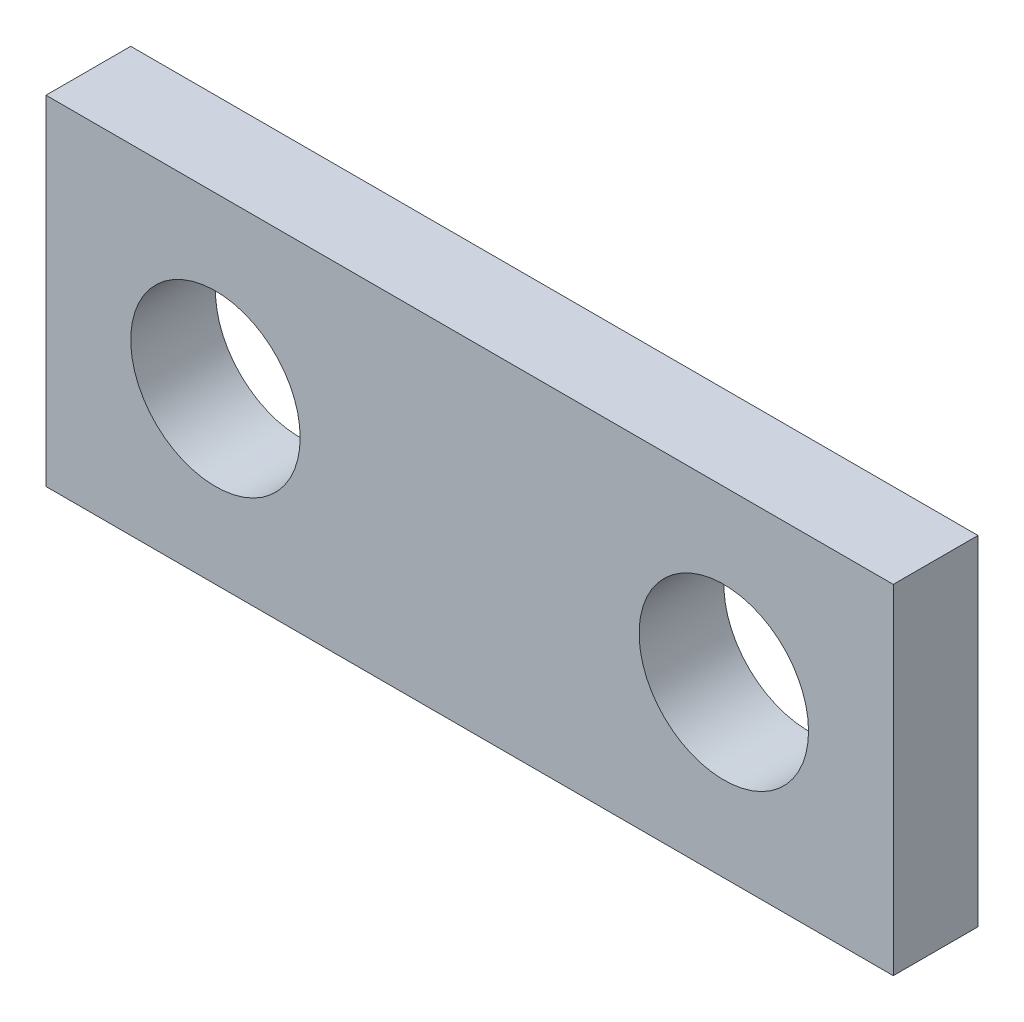
ISO-10303-21;
HEADER;
FILE_DESCRIPTION(('STEP AP214'),'2;1');
FILE_NAME('part.step','',(''),(''),'','','');
FILE_SCHEMA(('AUTOMOTIVE_DESIGN { 1 0 10303 214 1 1 1 1 }'));
ENDSEC;
DATA;
#1=APPLICATION_CONTEXT('core data for automotive mechanical design processes');
#2=APPLICATION_PROTOCOL_DEFINITION('international standard','automotive_design',2000,#1);
#3=PRODUCT_CONTEXT('',#1,'mechanical');
#4=PRODUCT('Part','Part','',(#3));
#5=PRODUCT_RELATED_PRODUCT_CATEGORY('part','',(#4));
#6=PRODUCT_DEFINITION_FORMATION('','',#4);
#7=PRODUCT_DEFINITION_CONTEXT('part definition',#1,'design');
#8=PRODUCT_DEFINITION('design','',#6,#7);
#9=PRODUCT_DEFINITION_SHAPE('','',#8);
#10=(LENGTH_UNIT() NAMED_UNIT(*) SI_UNIT(.MILLI.,.METRE.));
#11=(NAMED_UNIT(*) PLANE_ANGLE_UNIT() SI_UNIT($,.RADIAN.));
#12=(NAMED_UNIT(*) SI_UNIT($,.STERADIAN.) SOLID_ANGLE_UNIT());
#13=UNCERTAINTY_MEASURE_WITH_UNIT(LENGTH_MEASURE(1.E-05),#10,'distance_accuracy_value','');
#14=(GEOMETRIC_REPRESENTATION_CONTEXT(3) GLOBAL_UNCERTAINTY_ASSIGNED_CONTEXT((#13)) GLOBAL_UNIT_ASSIGNED_CONTEXT((#10,
#11,#12)) REPRESENTATION_CONTEXT('',''));
#15=CARTESIAN_POINT('',(0.,0.,0.));
#16=DIRECTION('',(0.,0.,1.));
#17=DIRECTION('',(1.,0.,0.));
#18=AXIS2_PLACEMENT_3D('',#15,#16,#17);
#19=CARTESIAN_POINT('',(0.,0.,5.));
#20=DIRECTION('',(0.,0.,1.));
#21=DIRECTION('',(1.,0.,0.));
#22=AXIS2_PLACEMENT_3D('',#19,#20,#21);
#23=PLANE('',#22);
#24=CARTESIAN_POINT('',(15.,0.,5.));
#25=DIRECTION('',(0.,0.,1.));
#26=DIRECTION('',(1.,0.,0.));
#27=AXIS2_PLACEMENT_3D('',#24,#25,#26);
#28=CIRCLE('',#27,5.);
#29=CARTESIAN_POINT('',(20.,0.,5.));
#30=VERTEX_POINT('',#29);
#31=EDGE_CURVE('E100',#30,#30,#28,.T.);
#32=ORIENTED_EDGE('',*,*,#31,.F.);
#33=EDGE_LOOP('',(#32));
#34=FACE_BOUND('',#33,.T.);
#35=DIRECTION('',(0.,1.,0.));
#36=VECTOR('',#35,1.);
#37=CARTESIAN_POINT('',(25.,10.,5.));
#38=LINE('',#37,#36);
#39=CARTESIAN_POINT('',(25.,-10.,5.));
#40=VERTEX_POINT('',#39);
#41=CARTESIAN_POINT('',(25.,10.,5.));
#42=VERTEX_POINT('',#41);
#43=EDGE_CURVE('E85',#40,#42,#38,.T.);
#44=ORIENTED_EDGE('',*,*,#43,.T.);
#45=DIRECTION('',(-1.,0.,0.));
#46=VECTOR('',#45,1.);
#47=CARTESIAN_POINT('',(-25.,10.,5.));
#48=LINE('',#47,#46);
#49=CARTESIAN_POINT('',(-25.,10.,5.));
#50=VERTEX_POINT('',#49);
#51=EDGE_CURVE('E80',#42,#50,#48,.T.);
#52=ORIENTED_EDGE('',*,*,#51,.T.);
#53=DIRECTION('',(0.,-1.,0.));
#54=VECTOR('',#53,1.);
#55=CARTESIAN_POINT('',(-25.,10.,5.));
#56=LINE('',#55,#54);
#57=CARTESIAN_POINT('',(-25.,-10.,5.));
#58=VERTEX_POINT('',#57);
#59=EDGE_CURVE('E83',#50,#58,#56,.T.);
#60=ORIENTED_EDGE('',*,*,#59,.T.);
#61=DIRECTION('',(1.,0.,0.));
#62=VECTOR('',#61,1.);
#63=CARTESIAN_POINT('',(-25.,-10.,5.));
#64=LINE('',#63,#62);
#65=EDGE_CURVE('E50',#58,#40,#64,.T.);
#66=ORIENTED_EDGE('',*,*,#65,.T.);
#67=EDGE_LOOP('',(#44,#52,#60,#66));
#68=FACE_BOUND('',#67,.T.);
#69=CARTESIAN_POINT('',(-15.,0.,5.));
#70=DIRECTION('',(0.,0.,1.));
#71=DIRECTION('',(1.,0.,0.));
#72=AXIS2_PLACEMENT_3D('',#69,#70,#71);
#73=CIRCLE('',#72,5.);
#74=CARTESIAN_POINT('',(-10.,0.,5.));
#75=VERTEX_POINT('',#74);
#76=EDGE_CURVE('E115',#75,#75,#73,.T.);
#77=ORIENTED_EDGE('',*,*,#76,.F.);
#78=EDGE_LOOP('',(#77));
#79=FACE_BOUND('',#78,.T.);
#80=ADVANCED_FACE('F33',(#34,#68,#79),#23,.T.);
#81=CARTESIAN_POINT('',(0.,0.,0.));
#82=DIRECTION('',(0.,0.,1.));
#83=DIRECTION('',(1.,0.,0.));
#84=AXIS2_PLACEMENT_3D('',#81,#82,#83);
#85=PLANE('',#84);
#86=DIRECTION('',(0.,1.,0.));
#87=VECTOR('',#86,1.);
#88=CARTESIAN_POINT('',(25.,10.,0.));
#89=LINE('',#88,#87);
#90=CARTESIAN_POINT('',(25.,-10.,0.));
#91=VERTEX_POINT('',#90);
#92=CARTESIAN_POINT('',(25.,10.,0.));
#93=VERTEX_POINT('',#92);
#94=EDGE_CURVE('E97',#91,#93,#89,.T.);
#95=ORIENTED_EDGE('',*,*,#94,.F.);
#96=DIRECTION('',(1.,0.,0.));
#97=VECTOR('',#96,1.);
#98=CARTESIAN_POINT('',(-25.,-10.,0.));
#99=LINE('',#98,#97);
#100=CARTESIAN_POINT('',(-25.,-10.,0.));
#101=VERTEX_POINT('',#100);
#102=EDGE_CURVE('E73',#101,#91,#99,.T.);
#103=ORIENTED_EDGE('',*,*,#102,.F.);
#104=DIRECTION('',(0.,-1.,0.));
#105=VECTOR('',#104,1.);
#106=CARTESIAN_POINT('',(-25.,10.,0.));
#107=LINE('',#106,#105);
#108=CARTESIAN_POINT('',(-25.,10.,0.));
#109=VERTEX_POINT('',#108);
#110=EDGE_CURVE('E67',#109,#101,#107,.T.);
#111=ORIENTED_EDGE('',*,*,#110,.F.);
#112=DIRECTION('',(-1.,0.,0.));
#113=VECTOR('',#112,1.);
#114=CARTESIAN_POINT('',(-25.,10.,0.));
#115=LINE('',#114,#113);
#116=EDGE_CURVE('E89',#93,#109,#115,.T.);
#117=ORIENTED_EDGE('',*,*,#116,.F.);
#118=EDGE_LOOP('',(#95,#103,#111,#117));
#119=FACE_BOUND('',#118,.T.);
#120=CARTESIAN_POINT('',(15.,0.,0.));
#121=DIRECTION('',(0.,0.,1.));
#122=DIRECTION('',(1.,0.,0.));
#123=AXIS2_PLACEMENT_3D('',#120,#121,#122);
#124=CIRCLE('',#123,5.);
#125=CARTESIAN_POINT('',(20.,0.,0.));
#126=VERTEX_POINT('',#125);
#127=EDGE_CURVE('E112',#126,#126,#124,.T.);
#128=ORIENTED_EDGE('',*,*,#127,.T.);
#129=EDGE_LOOP('',(#128));
#130=FACE_BOUND('',#129,.T.);
#131=CARTESIAN_POINT('',(-15.,0.,0.));
#132=DIRECTION('',(0.,0.,1.));
#133=DIRECTION('',(1.,0.,0.));
#134=AXIS2_PLACEMENT_3D('',#131,#132,#133);
#135=CIRCLE('',#134,5.);
#136=CARTESIAN_POINT('',(-10.,0.,0.));
#137=VERTEX_POINT('',#136);
#138=EDGE_CURVE('E118',#137,#137,#135,.T.);
#139=ORIENTED_EDGE('',*,*,#138,.T.);
#140=EDGE_LOOP('',(#139));
#141=FACE_BOUND('',#140,.T.);
#142=ADVANCED_FACE('F108',(#119,#130,#141),#85,.F.);
#143=CARTESIAN_POINT('',(25.,10.,5.));
#144=DIRECTION('',(-1.,0.,0.));
#145=DIRECTION('',(0.,0.,1.));
#146=AXIS2_PLACEMENT_3D('',#143,#144,#145);
#147=PLANE('',#146);
#148=ORIENTED_EDGE('',*,*,#94,.T.);
#149=DIRECTION('',(0.,0.,-1.));
#150=VECTOR('',#149,1.);
#151=CARTESIAN_POINT('',(25.,10.,5.));
#152=LINE('',#151,#150);
#153=EDGE_CURVE('E11',#42,#93,#152,.T.);
#154=ORIENTED_EDGE('',*,*,#153,.F.);
#155=ORIENTED_EDGE('',*,*,#43,.F.);
#156=DIRECTION('',(0.,0.,-1.));
#157=VECTOR('',#156,1.);
#158=CARTESIAN_POINT('',(25.,-10.,5.));
#159=LINE('',#158,#157);
#160=EDGE_CURVE('E93',#40,#91,#159,.T.);
#161=ORIENTED_EDGE('',*,*,#160,.T.);
#162=EDGE_LOOP('',(#148,#154,#155,#161));
#163=FACE_BOUND('',#162,.T.);
#164=ADVANCED_FACE('F35',(#163),#147,.F.);
#165=CARTESIAN_POINT('',(-25.,10.,5.));
#166=DIRECTION('',(0.,-1.,0.));
#167=DIRECTION('',(0.,0.,-1.));
#168=AXIS2_PLACEMENT_3D('',#165,#166,#167);
#169=PLANE('',#168);
#170=ORIENTED_EDGE('',*,*,#116,.T.);
#171=DIRECTION('',(0.,0.,-1.));
#172=VECTOR('',#171,1.);
#173=CARTESIAN_POINT('',(-25.,10.,5.));
#174=LINE('',#173,#172);
#175=EDGE_CURVE('E42',#50,#109,#174,.T.);
#176=ORIENTED_EDGE('',*,*,#175,.F.);
#177=ORIENTED_EDGE('',*,*,#51,.F.);
#178=ORIENTED_EDGE('',*,*,#153,.T.);
#179=EDGE_LOOP('',(#170,#176,#177,#178));
#180=FACE_BOUND('',#179,.T.);
#181=ADVANCED_FACE('F88',(#180),#169,.F.);
#182=CARTESIAN_POINT('',(-25.,10.,5.));
#183=DIRECTION('',(1.,0.,0.));
#184=DIRECTION('',(0.,0.,-1.));
#185=AXIS2_PLACEMENT_3D('',#182,#183,#184);
#186=PLANE('',#185);
#187=ORIENTED_EDGE('',*,*,#110,.T.);
#188=DIRECTION('',(0.,0.,-1.));
#189=VECTOR('',#188,1.);
#190=CARTESIAN_POINT('',(-25.,-10.,5.));
#191=LINE('',#190,#189);
#192=EDGE_CURVE('E90',#58,#101,#191,.T.);
#193=ORIENTED_EDGE('',*,*,#192,.F.);
#194=ORIENTED_EDGE('',*,*,#59,.F.);
#195=ORIENTED_EDGE('',*,*,#175,.T.);
#196=EDGE_LOOP('',(#187,#193,#194,#195));
#197=FACE_BOUND('',#196,.T.);
#198=ADVANCED_FACE('F91',(#197),#186,.F.);
#199=CARTESIAN_POINT('',(-25.,-10.,5.));
#200=DIRECTION('',(0.,1.,0.));
#201=DIRECTION('',(0.,0.,1.));
#202=AXIS2_PLACEMENT_3D('',#199,#200,#201);
#203=PLANE('',#202);
#204=ORIENTED_EDGE('',*,*,#102,.T.);
#205=ORIENTED_EDGE('',*,*,#160,.F.);
#206=ORIENTED_EDGE('',*,*,#65,.F.);
#207=ORIENTED_EDGE('',*,*,#192,.T.);
#208=EDGE_LOOP('',(#204,#205,#206,#207));
#209=FACE_BOUND('',#208,.T.);
#210=ADVANCED_FACE('F105',(#209),#203,.F.);
#211=CARTESIAN_POINT('',(15.,0.,5.));
#212=DIRECTION('',(0.,0.,-1.));
#213=DIRECTION('',(-1.,0.,0.));
#214=AXIS2_PLACEMENT_3D('',#211,#212,#213);
#215=CYLINDRICAL_SURFACE('',#214,5.);
#216=ORIENTED_EDGE('',*,*,#31,.T.);
#217=EDGE_LOOP('',(#216));
#218=FACE_BOUND('',#217,.T.);
#219=ORIENTED_EDGE('',*,*,#127,.F.);
#220=EDGE_LOOP('',(#219));
#221=FACE_BOUND('',#220,.T.);
#222=ADVANCED_FACE('F135',(#218,#221),#215,.F.);
#223=CARTESIAN_POINT('',(-15.,0.,5.));
#224=DIRECTION('',(0.,0.,-1.));
#225=DIRECTION('',(-1.,0.,0.));
#226=AXIS2_PLACEMENT_3D('',#223,#224,#225);
#227=CYLINDRICAL_SURFACE('',#226,5.);
#228=ORIENTED_EDGE('',*,*,#76,.T.);
#229=EDGE_LOOP('',(#228));
#230=FACE_BOUND('',#229,.T.);
#231=ORIENTED_EDGE('',*,*,#138,.F.);
#232=EDGE_LOOP('',(#231));
#233=FACE_BOUND('',#232,.T.);
#234=ADVANCED_FACE('F124',(#230,#233),#227,.F.);
#235=CLOSED_SHELL('',(#80,#142,#164,#181,#198,#210,#222,#234));
#236=MANIFOLD_SOLID_BREP('B2',#235);
#237=ADVANCED_BREP_SHAPE_REPRESENTATION('',(#18,#236),#14);
#238=SHAPE_DEFINITION_REPRESENTATION(#9,#237);
ENDSEC;
END-ISO-10303-21;
